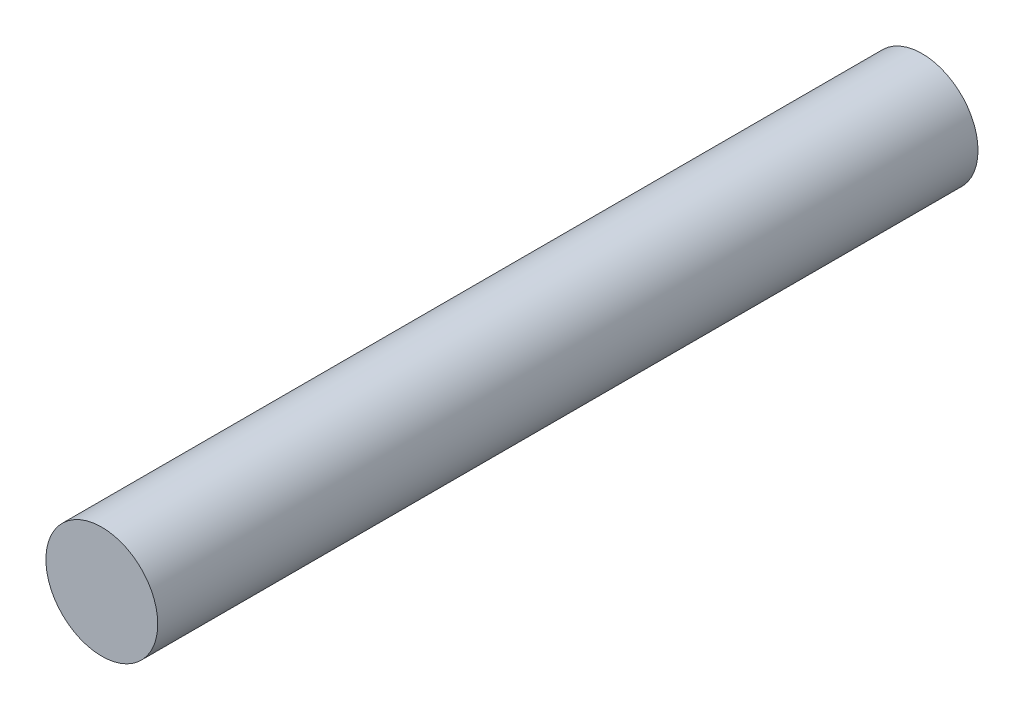
ISO-10303-21;
HEADER;
FILE_DESCRIPTION(('STEP AP214'),'2;1');
FILE_NAME('part.step','',(''),(''),'','','');
FILE_SCHEMA(('AUTOMOTIVE_DESIGN { 1 0 10303 214 1 1 1 1 }'));
ENDSEC;
DATA;
#1=APPLICATION_CONTEXT('core data for automotive mechanical design processes');
#2=APPLICATION_PROTOCOL_DEFINITION('international standard','automotive_design',2000,#1);
#3=PRODUCT_CONTEXT('',#1,'mechanical');
#4=PRODUCT('Part','Part','',(#3));
#5=PRODUCT_RELATED_PRODUCT_CATEGORY('part','',(#4));
#6=PRODUCT_DEFINITION_FORMATION('','',#4);
#7=PRODUCT_DEFINITION_CONTEXT('part definition',#1,'design');
#8=PRODUCT_DEFINITION('design','',#6,#7);
#9=PRODUCT_DEFINITION_SHAPE('','',#8);
#10=(LENGTH_UNIT() NAMED_UNIT(*) SI_UNIT(.MILLI.,.METRE.));
#11=(NAMED_UNIT(*) PLANE_ANGLE_UNIT() SI_UNIT($,.RADIAN.));
#12=(NAMED_UNIT(*) SI_UNIT($,.STERADIAN.) SOLID_ANGLE_UNIT());
#13=UNCERTAINTY_MEASURE_WITH_UNIT(LENGTH_MEASURE(1.E-05),#10,'distance_accuracy_value','');
#14=(GEOMETRIC_REPRESENTATION_CONTEXT(3) GLOBAL_UNCERTAINTY_ASSIGNED_CONTEXT((#13)) GLOBAL_UNIT_ASSIGNED_CONTEXT((#10,
#11,#12)) REPRESENTATION_CONTEXT('',''));
#15=CARTESIAN_POINT('',(0.,0.,0.));
#16=DIRECTION('',(0.,0.,1.));
#17=DIRECTION('',(1.,0.,0.));
#18=AXIS2_PLACEMENT_3D('',#15,#16,#17);
#19=CARTESIAN_POINT('',(0.,0.,22.));
#20=DIRECTION('',(0.,0.,-1.));
#21=DIRECTION('',(-1.,0.,0.));
#22=AXIS2_PLACEMENT_3D('',#19,#20,#21);
#23=CYLINDRICAL_SURFACE('',#22,1.5);
#24=CARTESIAN_POINT('',(0.,0.,22.));
#25=DIRECTION('',(0.,0.,1.));
#26=DIRECTION('',(1.,0.,0.));
#27=AXIS2_PLACEMENT_3D('',#24,#25,#26);
#28=CIRCLE('',#27,1.5);
#29=CARTESIAN_POINT('',(1.5,0.,22.));
#30=VERTEX_POINT('',#29);
#31=EDGE_CURVE('E12',#30,#30,#28,.T.);
#32=ORIENTED_EDGE('',*,*,#31,.F.);
#33=EDGE_LOOP('',(#32));
#34=FACE_BOUND('',#33,.T.);
#35=CARTESIAN_POINT('',(0.,0.,0.));
#36=DIRECTION('',(0.,0.,1.));
#37=DIRECTION('',(1.,0.,0.));
#38=AXIS2_PLACEMENT_3D('',#35,#36,#37);
#39=CIRCLE('',#38,1.5);
#40=CARTESIAN_POINT('',(1.5,0.,0.));
#41=VERTEX_POINT('',#40);
#42=EDGE_CURVE('E44',#41,#41,#39,.T.);
#43=ORIENTED_EDGE('',*,*,#42,.T.);
#44=EDGE_LOOP('',(#43));
#45=FACE_BOUND('',#44,.T.);
#46=ADVANCED_FACE('F41',(#34,#45),#23,.T.);
#47=CARTESIAN_POINT('',(0.,0.,22.));
#48=DIRECTION('',(0.,0.,1.));
#49=DIRECTION('',(1.,0.,0.));
#50=AXIS2_PLACEMENT_3D('',#47,#48,#49);
#51=PLANE('',#50);
#52=ORIENTED_EDGE('',*,*,#31,.T.);
#53=EDGE_LOOP('',(#52));
#54=FACE_BOUND('',#53,.T.);
#55=ADVANCED_FACE('F56',(#54),#51,.T.);
#56=CARTESIAN_POINT('',(0.,0.,0.));
#57=DIRECTION('',(0.,0.,1.));
#58=DIRECTION('',(1.,0.,0.));
#59=AXIS2_PLACEMENT_3D('',#56,#57,#58);
#60=PLANE('',#59);
#61=ORIENTED_EDGE('',*,*,#42,.F.);
#62=EDGE_LOOP('',(#61));
#63=FACE_BOUND('',#62,.T.);
#64=ADVANCED_FACE('F54',(#63),#60,.F.);
#65=CLOSED_SHELL('',(#46,#55,#64));
#66=MANIFOLD_SOLID_BREP('B2',#65);
#67=ADVANCED_BREP_SHAPE_REPRESENTATION('',(#18,#66),#14);
#68=SHAPE_DEFINITION_REPRESENTATION(#9,#67);
ENDSEC;
END-ISO-10303-21;
